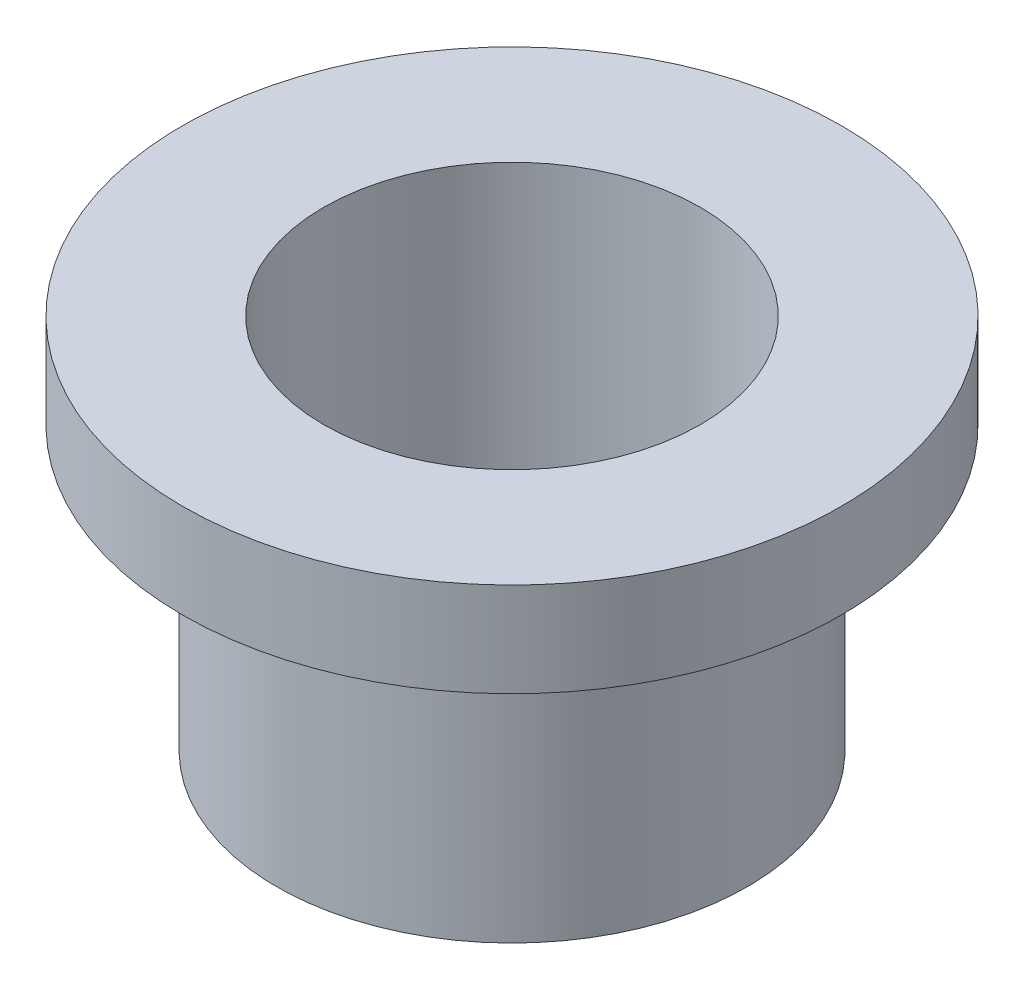
ISO-10303-21;
HEADER;
FILE_DESCRIPTION(('STEP AP214'),'2;1');
FILE_NAME('part.step','',(''),(''),'','','');
FILE_SCHEMA(('AUTOMOTIVE_DESIGN { 1 0 10303 214 1 1 1 1 }'));
ENDSEC;
DATA;
#1=APPLICATION_CONTEXT('core data for automotive mechanical design processes');
#2=APPLICATION_PROTOCOL_DEFINITION('international standard','automotive_design',2000,#1);
#3=PRODUCT_CONTEXT('',#1,'mechanical');
#4=PRODUCT('Part','Part','',(#3));
#5=PRODUCT_RELATED_PRODUCT_CATEGORY('part','',(#4));
#6=PRODUCT_DEFINITION_FORMATION('','',#4);
#7=PRODUCT_DEFINITION_CONTEXT('part definition',#1,'design');
#8=PRODUCT_DEFINITION('design','',#6,#7);
#9=PRODUCT_DEFINITION_SHAPE('','',#8);
#10=(LENGTH_UNIT() NAMED_UNIT(*) SI_UNIT(.MILLI.,.METRE.));
#11=(NAMED_UNIT(*) PLANE_ANGLE_UNIT() SI_UNIT($,.RADIAN.));
#12=(NAMED_UNIT(*) SI_UNIT($,.STERADIAN.) SOLID_ANGLE_UNIT());
#13=UNCERTAINTY_MEASURE_WITH_UNIT(LENGTH_MEASURE(1.E-05),#10,'distance_accuracy_value','');
#14=(GEOMETRIC_REPRESENTATION_CONTEXT(3) GLOBAL_UNCERTAINTY_ASSIGNED_CONTEXT((#13)) GLOBAL_UNIT_ASSIGNED_CONTEXT((#10,
#11,#12)) REPRESENTATION_CONTEXT('',''));
#15=CARTESIAN_POINT('',(0.,0.,0.));
#16=DIRECTION('',(0.,0.,1.));
#17=DIRECTION('',(1.,0.,0.));
#18=AXIS2_PLACEMENT_3D('',#15,#16,#17);
#19=CARTESIAN_POINT('',(0.,0.,0.));
#20=DIRECTION('',(0.,1.,0.));
#21=DIRECTION('',(0.,0.,1.));
#22=AXIS2_PLACEMENT_3D('',#19,#20,#21);
#23=PLANE('',#22);
#24=CARTESIAN_POINT('',(0.,0.,0.));
#25=DIRECTION('',(0.,1.,0.));
#26=DIRECTION('',(0.,0.,1.));
#27=AXIS2_PLACEMENT_3D('',#24,#25,#26);
#28=CIRCLE('',#27,7.9375);
#29=CARTESIAN_POINT('',(0.,0.,-7.9375));
#30=VERTEX_POINT('',#29);
#31=EDGE_CURVE('E38',#30,#30,#28,.T.);
#32=ORIENTED_EDGE('',*,*,#31,.F.);
#33=EDGE_LOOP('',(#32));
#34=FACE_BOUND('',#33,.T.);
#35=CARTESIAN_POINT('',(0.,0.,0.));
#36=DIRECTION('',(0.,1.,0.));
#37=DIRECTION('',(0.,0.,1.));
#38=AXIS2_PLACEMENT_3D('',#35,#36,#37);
#39=CIRCLE('',#38,6.35);
#40=CARTESIAN_POINT('',(0.,0.,-6.35));
#41=VERTEX_POINT('',#40);
#42=EDGE_CURVE('E45',#41,#41,#39,.T.);
#43=ORIENTED_EDGE('',*,*,#42,.T.);
#44=EDGE_LOOP('',(#43));
#45=FACE_BOUND('',#44,.T.);
#46=ADVANCED_FACE('F34',(#34,#45),#23,.F.);
#47=CARTESIAN_POINT('',(0.,9.525,0.));
#48=DIRECTION('',(0.,-1.,0.));
#49=DIRECTION('',(0.,0.,-1.));
#50=AXIS2_PLACEMENT_3D('',#47,#48,#49);
#51=CYLINDRICAL_SURFACE('',#50,7.9375);
#52=CARTESIAN_POINT('',(0.,9.525,0.));
#53=DIRECTION('',(0.,1.,0.));
#54=DIRECTION('',(0.,0.,1.));
#55=AXIS2_PLACEMENT_3D('',#52,#53,#54);
#56=CIRCLE('',#55,7.9375);
#57=CARTESIAN_POINT('',(0.,9.525,-7.9375));
#58=VERTEX_POINT('',#57);
#59=EDGE_CURVE('E10',#58,#58,#56,.T.);
#60=CARTESIAN_POINT('',(0.,9.525,-7.9375));
#61=CARTESIAN_POINT('',(0.,9.42578125,-7.9375));
#62=CARTESIAN_POINT('',(0.,9.3265625,-7.9375));
#63=CARTESIAN_POINT('',(0.,9.128125,-7.9375));
#64=CARTESIAN_POINT('',(0.,9.02890625,-7.9375));
#65=CARTESIAN_POINT('',(0.,8.83046875,-7.9375));
#66=CARTESIAN_POINT('',(0.,8.73125,-7.9375));
#67=CARTESIAN_POINT('',(0.,8.5328125,-7.9375));
#68=CARTESIAN_POINT('',(0.,8.43359375,-7.9375));
#69=CARTESIAN_POINT('',(0.,8.23515625,-7.9375));
#70=CARTESIAN_POINT('',(0.,8.1359375,-7.9375));
#71=CARTESIAN_POINT('',(0.,7.9375,-7.9375));
#72=CARTESIAN_POINT('',(0.,7.83828125,-7.9375));
#73=CARTESIAN_POINT('',(0.,7.63984375,-7.9375));
#74=CARTESIAN_POINT('',(0.,7.540625,-7.9375));
#75=CARTESIAN_POINT('',(0.,7.3421875,-7.9375));
#76=CARTESIAN_POINT('',(0.,7.24296875,-7.9375));
#77=CARTESIAN_POINT('',(0.,7.04453125,-7.9375));
#78=CARTESIAN_POINT('',(0.,6.9453125,-7.9375));
#79=CARTESIAN_POINT('',(0.,6.746875,-7.9375));
#80=CARTESIAN_POINT('',(0.,6.64765625,-7.9375));
#81=CARTESIAN_POINT('',(0.,6.44921875,-7.9375));
#82=CARTESIAN_POINT('',(0.,6.35,-7.9375));
#83=CARTESIAN_POINT('',(0.,6.1515625,-7.9375));
#84=CARTESIAN_POINT('',(0.,6.05234375,-7.9375));
#85=CARTESIAN_POINT('',(0.,5.85390625,-7.9375));
#86=CARTESIAN_POINT('',(0.,5.7546875,-7.9375));
#87=CARTESIAN_POINT('',(0.,5.55625,-7.9375));
#88=CARTESIAN_POINT('',(0.,5.45703125,-7.9375));
#89=CARTESIAN_POINT('',(0.,5.25859375,-7.9375));
#90=CARTESIAN_POINT('',(0.,5.159375,-7.9375));
#91=CARTESIAN_POINT('',(0.,4.9609375,-7.9375));
#92=CARTESIAN_POINT('',(0.,4.86171875,-7.9375));
#93=CARTESIAN_POINT('',(0.,4.66328125,-7.9375));
#94=CARTESIAN_POINT('',(0.,4.5640625,-7.9375));
#95=CARTESIAN_POINT('',(0.,4.365625,-7.9375));
#96=CARTESIAN_POINT('',(0.,4.26640625,-7.9375));
#97=CARTESIAN_POINT('',(0.,4.06796875,-7.9375));
#98=CARTESIAN_POINT('',(0.,3.96875,-7.9375));
#99=CARTESIAN_POINT('',(0.,3.7703125,-7.9375));
#100=CARTESIAN_POINT('',(0.,3.67109375,-7.9375));
#101=CARTESIAN_POINT('',(0.,3.47265625,-7.9375));
#102=CARTESIAN_POINT('',(0.,3.3734375,-7.9375));
#103=CARTESIAN_POINT('',(0.,3.175,-7.9375));
#104=CARTESIAN_POINT('',(0.,3.07578125,-7.9375));
#105=CARTESIAN_POINT('',(0.,2.87734375,-7.9375));
#106=CARTESIAN_POINT('',(0.,2.778125,-7.9375));
#107=CARTESIAN_POINT('',(0.,2.5796875,-7.9375));
#108=CARTESIAN_POINT('',(0.,2.48046875,-7.9375));
#109=CARTESIAN_POINT('',(0.,2.28203125,-7.9375));
#110=CARTESIAN_POINT('',(0.,2.1828125,-7.9375));
#111=CARTESIAN_POINT('',(0.,1.984375,-7.9375));
#112=CARTESIAN_POINT('',(0.,1.88515625,-7.9375));
#113=CARTESIAN_POINT('',(0.,1.68671875,-7.9375));
#114=CARTESIAN_POINT('',(0.,1.5875,-7.9375));
#115=CARTESIAN_POINT('',(0.,1.3890625,-7.9375));
#116=CARTESIAN_POINT('',(0.,1.28984375,-7.9375));
#117=CARTESIAN_POINT('',(0.,1.09140625,-7.9375));
#118=CARTESIAN_POINT('',(0.,0.992187500000001,-7.9375));
#119=CARTESIAN_POINT('',(0.,0.793750000000001,-7.9375));
#120=CARTESIAN_POINT('',(0.,0.69453125,-7.9375));
#121=CARTESIAN_POINT('',(0.,0.49609375,-7.9375));
#122=CARTESIAN_POINT('',(0.,0.396875,-7.9375));
#123=CARTESIAN_POINT('',(0.,0.1984375,-7.9375));
#124=CARTESIAN_POINT('',(0.,0.0992187500000001,-7.9375));
#125=CARTESIAN_POINT('',(0.,0.,-7.9375));
#126=B_SPLINE_CURVE_WITH_KNOTS('',3,(#60,#61,#62,#63,#64,#65,#66,#67,#68,#69,#70,#71,#72,#73,
#74,#75,#76,#77,#78,#79,#80,#81,#82,#83,#84,#85,#86,#87,#88,#89,#90,#91,#92,#93,#94,#95,#96,#97,
#98,#99,#100,#101,#102,#103,#104,#105,#106,#107,#108,#109,#110,#111,#112,#113,#114,#115,#116,
#117,#118,#119,#120,#121,#122,#123,#124,#125),.UNSPECIFIED.,.F.,.F.,(4,2,2,2,2,2,2,2,2,2,2,2,2,
2,2,2,2,2,2,2,2,2,2,2,2,2,2,2,2,2,2,2,4),(0.,0.297656249999998,0.595312499999999,
0.892968749999999,1.190625,1.48828125,1.7859375,2.08359375,2.38125,2.67890625,2.9765625,
3.27421875,3.571875,3.86953125,4.1671875,4.46484375,4.7625,5.06015625,5.3578125,5.65546875,
5.953125,6.25078125,6.5484375,6.84609375,7.14375,7.44140625,7.7390625,8.03671875,8.334375,
8.63203125,8.9296875,9.22734375,9.525),.UNSPECIFIED.);
#127=EDGE_CURVE('BSEAM36',#58,#30,#126,.T.);
#128=ORIENTED_EDGE('',*,*,#59,.F.);
#129=ORIENTED_EDGE('',*,*,#31,.T.);
#130=ORIENTED_EDGE('',*,*,#127,.T.);
#131=ORIENTED_EDGE('',*,*,#127,.F.);
#132=EDGE_LOOP('',(#128,#130,#129,#131));
#133=FACE_BOUND('',#132,.T.);
#134=ADVANCED_FACE('F36',(#133),#51,.T.);
#135=CARTESIAN_POINT('',(0.,9.525,0.));
#136=DIRECTION('',(0.,-1.,0.));
#137=DIRECTION('',(0.,0.,-1.));
#138=AXIS2_PLACEMENT_3D('',#135,#136,#137);
#139=CYLINDRICAL_SURFACE('',#138,6.35);
#140=CARTESIAN_POINT('',(0.,12.7,0.));
#141=DIRECTION('',(0.,1.,0.));
#142=DIRECTION('',(0.,0.,1.));
#143=AXIS2_PLACEMENT_3D('',#140,#141,#142);
#144=CIRCLE('',#143,6.35);
#145=CARTESIAN_POINT('',(0.,12.7,-6.35));
#146=VERTEX_POINT('',#145);
#147=EDGE_CURVE('E53',#146,#146,#144,.T.);
#148=CARTESIAN_POINT('',(0.,0.,-6.35));
#149=CARTESIAN_POINT('',(0.,0.132291666666667,-6.35));
#150=CARTESIAN_POINT('',(0.,0.264583333333333,-6.35));
#151=CARTESIAN_POINT('',(0.,0.529166666666666,-6.35));
#152=CARTESIAN_POINT('',(0.,0.661458333333333,-6.35));
#153=CARTESIAN_POINT('',(0.,0.926041666666666,-6.35));
#154=CARTESIAN_POINT('',(0.,1.05833333333333,-6.35));
#155=CARTESIAN_POINT('',(0.,1.32291666666667,-6.35));
#156=CARTESIAN_POINT('',(0.,1.45520833333333,-6.35));
#157=CARTESIAN_POINT('',(0.,1.71979166666667,-6.35));
#158=CARTESIAN_POINT('',(0.,1.85208333333333,-6.35));
#159=CARTESIAN_POINT('',(0.,2.11666666666667,-6.35));
#160=CARTESIAN_POINT('',(0.,2.24895833333333,-6.35));
#161=CARTESIAN_POINT('',(0.,2.51354166666667,-6.35));
#162=CARTESIAN_POINT('',(0.,2.64583333333333,-6.35));
#163=CARTESIAN_POINT('',(0.,2.91041666666667,-6.35));
#164=CARTESIAN_POINT('',(0.,3.04270833333333,-6.35));
#165=CARTESIAN_POINT('',(0.,3.30729166666667,-6.35));
#166=CARTESIAN_POINT('',(0.,3.43958333333333,-6.35));
#167=CARTESIAN_POINT('',(0.,3.70416666666667,-6.35));
#168=CARTESIAN_POINT('',(0.,3.83645833333333,-6.35));
#169=CARTESIAN_POINT('',(0.,4.10104166666667,-6.35));
#170=CARTESIAN_POINT('',(0.,4.23333333333333,-6.35));
#171=CARTESIAN_POINT('',(0.,4.49791666666667,-6.35));
#172=CARTESIAN_POINT('',(0.,4.63020833333333,-6.35));
#173=CARTESIAN_POINT('',(0.,4.89479166666667,-6.35));
#174=CARTESIAN_POINT('',(0.,5.02708333333333,-6.35));
#175=CARTESIAN_POINT('',(0.,5.29166666666667,-6.35));
#176=CARTESIAN_POINT('',(0.,5.42395833333333,-6.35));
#177=CARTESIAN_POINT('',(0.,5.68854166666667,-6.35));
#178=CARTESIAN_POINT('',(0.,5.82083333333333,-6.35));
#179=CARTESIAN_POINT('',(0.,6.08541666666667,-6.35));
#180=CARTESIAN_POINT('',(0.,6.21770833333333,-6.35));
#181=CARTESIAN_POINT('',(0.,6.48229166666667,-6.35));
#182=CARTESIAN_POINT('',(0.,6.61458333333333,-6.35));
#183=CARTESIAN_POINT('',(0.,6.87916666666666,-6.35));
#184=CARTESIAN_POINT('',(0.,7.01145833333333,-6.35));
#185=CARTESIAN_POINT('',(0.,7.27604166666667,-6.35));
#186=CARTESIAN_POINT('',(0.,7.40833333333333,-6.35));
#187=CARTESIAN_POINT('',(0.,7.67291666666667,-6.35));
#188=CARTESIAN_POINT('',(0.,7.80520833333333,-6.35));
#189=CARTESIAN_POINT('',(0.,8.06979166666666,-6.35));
#190=CARTESIAN_POINT('',(0.,8.20208333333333,-6.35));
#191=CARTESIAN_POINT('',(0.,8.46666666666666,-6.35));
#192=CARTESIAN_POINT('',(0.,8.59895833333333,-6.35));
#193=CARTESIAN_POINT('',(0.,8.86354166666666,-6.35));
#194=CARTESIAN_POINT('',(0.,8.99583333333333,-6.35));
#195=CARTESIAN_POINT('',(0.,9.26041666666666,-6.35));
#196=CARTESIAN_POINT('',(0.,9.39270833333333,-6.35));
#197=CARTESIAN_POINT('',(0.,9.65729166666666,-6.35));
#198=CARTESIAN_POINT('',(0.,9.78958333333333,-6.35));
#199=CARTESIAN_POINT('',(0.,10.0541666666667,-6.35));
#200=CARTESIAN_POINT('',(0.,10.1864583333333,-6.35));
#201=CARTESIAN_POINT('',(0.,10.4510416666667,-6.35));
#202=CARTESIAN_POINT('',(0.,10.5833333333333,-6.35));
#203=CARTESIAN_POINT('',(0.,10.8479166666667,-6.35));
#204=CARTESIAN_POINT('',(0.,10.9802083333333,-6.35));
#205=CARTESIAN_POINT('',(0.,11.2447916666667,-6.35));
#206=CARTESIAN_POINT('',(0.,11.3770833333333,-6.35));
#207=CARTESIAN_POINT('',(0.,11.6416666666667,-6.35));
#208=CARTESIAN_POINT('',(0.,11.7739583333333,-6.35));
#209=CARTESIAN_POINT('',(0.,12.0385416666667,-6.35));
#210=CARTESIAN_POINT('',(0.,12.1708333333333,-6.35));
#211=CARTESIAN_POINT('',(0.,12.4354166666667,-6.35));
#212=CARTESIAN_POINT('',(0.,12.5677083333333,-6.35));
#213=CARTESIAN_POINT('',(0.,12.7,-6.35));
#214=B_SPLINE_CURVE_WITH_KNOTS('',3,(#148,#149,#150,#151,#152,#153,#154,#155,#156,#157,#158,
#159,#160,#161,#162,#163,#164,#165,#166,#167,#168,#169,#170,#171,#172,#173,#174,#175,#176,#177,
#178,#179,#180,#181,#182,#183,#184,#185,#186,#187,#188,#189,#190,#191,#192,#193,#194,#195,#196,
#197,#198,#199,#200,#201,#202,#203,#204,#205,#206,#207,#208,#209,#210,#211,#212,#213),
.UNSPECIFIED.,.F.,.F.,(4,2,2,2,2,2,2,2,2,2,2,2,2,2,2,2,2,2,2,2,2,2,2,2,2,2,2,2,2,2,2,2,4),(0.,
0.396875,0.793749999999999,1.190625,1.5875,1.984375,2.38125,2.778125,3.175,3.571875,3.96875,
4.365625,4.7625,5.159375,5.55625,5.953125,6.35,6.746875,7.14375,7.540625,7.9375,8.334375,
8.73125,9.128125,9.525,9.921875,10.31875,10.715625,11.1125,11.509375,11.90625,12.303125,12.7),.UNSPECIFIED.);
#215=EDGE_CURVE('BSEAM59',#41,#146,#214,.T.);
#216=ORIENTED_EDGE('',*,*,#42,.F.);
#217=ORIENTED_EDGE('',*,*,#147,.T.);
#218=ORIENTED_EDGE('',*,*,#215,.T.);
#219=ORIENTED_EDGE('',*,*,#215,.F.);
#220=EDGE_LOOP('',(#216,#218,#217,#219));
#221=FACE_BOUND('',#220,.T.);
#222=ADVANCED_FACE('F59',(#221),#139,.F.);
#223=CARTESIAN_POINT('',(0.,9.525,0.));
#224=DIRECTION('',(0.,1.,0.));
#225=DIRECTION('',(0.,0.,1.));
#226=AXIS2_PLACEMENT_3D('',#223,#224,#225);
#227=PLANE('',#226);
#228=CARTESIAN_POINT('',(0.,9.525,0.));
#229=DIRECTION('',(0.,1.,0.));
#230=DIRECTION('',(0.,0.,1.));
#231=AXIS2_PLACEMENT_3D('',#228,#229,#230);
#232=CIRCLE('',#231,11.1125);
#233=CARTESIAN_POINT('',(0.,9.525,11.1125));
#234=VERTEX_POINT('',#233);
#235=EDGE_CURVE('E50',#234,#234,#232,.T.);
#236=ORIENTED_EDGE('',*,*,#235,.F.);
#237=EDGE_LOOP('',(#236));
#238=FACE_BOUND('',#237,.T.);
#239=ORIENTED_EDGE('',*,*,#59,.T.);
#240=EDGE_LOOP('',(#239));
#241=FACE_BOUND('',#240,.T.);
#242=ADVANCED_FACE('F64',(#238,#241),#227,.F.);
#243=CARTESIAN_POINT('',(0.,12.7,0.));
#244=DIRECTION('',(0.,1.,0.));
#245=DIRECTION('',(0.,0.,1.));
#246=AXIS2_PLACEMENT_3D('',#243,#244,#245);
#247=PLANE('',#246);
#248=CARTESIAN_POINT('',(0.,12.7,0.));
#249=DIRECTION('',(0.,1.,0.));
#250=DIRECTION('',(0.,0.,1.));
#251=AXIS2_PLACEMENT_3D('',#248,#249,#250);
#252=CIRCLE('',#251,11.1125);
#253=CARTESIAN_POINT('',(0.,12.7,11.1125));
#254=VERTEX_POINT('',#253);
#255=EDGE_CURVE('E49',#254,#254,#252,.T.);
#256=ORIENTED_EDGE('',*,*,#255,.T.);
#257=EDGE_LOOP('',(#256));
#258=FACE_BOUND('',#257,.T.);
#259=ORIENTED_EDGE('',*,*,#147,.F.);
#260=EDGE_LOOP('',(#259));
#261=FACE_BOUND('',#260,.T.);
#262=ADVANCED_FACE('F61',(#258,#261),#247,.T.);
#263=CARTESIAN_POINT('',(0.,12.7,0.));
#264=DIRECTION('',(0.,-1.,0.));
#265=DIRECTION('',(0.,0.,-1.));
#266=AXIS2_PLACEMENT_3D('',#263,#264,#265);
#267=CYLINDRICAL_SURFACE('',#266,11.1125);
#268=ORIENTED_EDGE('',*,*,#255,.F.);
#269=EDGE_LOOP('',(#268));
#270=FACE_BOUND('',#269,.T.);
#271=ORIENTED_EDGE('',*,*,#235,.T.);
#272=EDGE_LOOP('',(#271));
#273=FACE_BOUND('',#272,.T.);
#274=ADVANCED_FACE('F63',(#270,#273),#267,.T.);
#275=CLOSED_SHELL('',(#46,#134,#222,#242,#262,#274));
#276=MANIFOLD_SOLID_BREP('B2',#275);
#277=ADVANCED_BREP_SHAPE_REPRESENTATION('',(#18,#276),#14);
#278=SHAPE_DEFINITION_REPRESENTATION(#9,#277);
ENDSEC;
END-ISO-10303-21;
